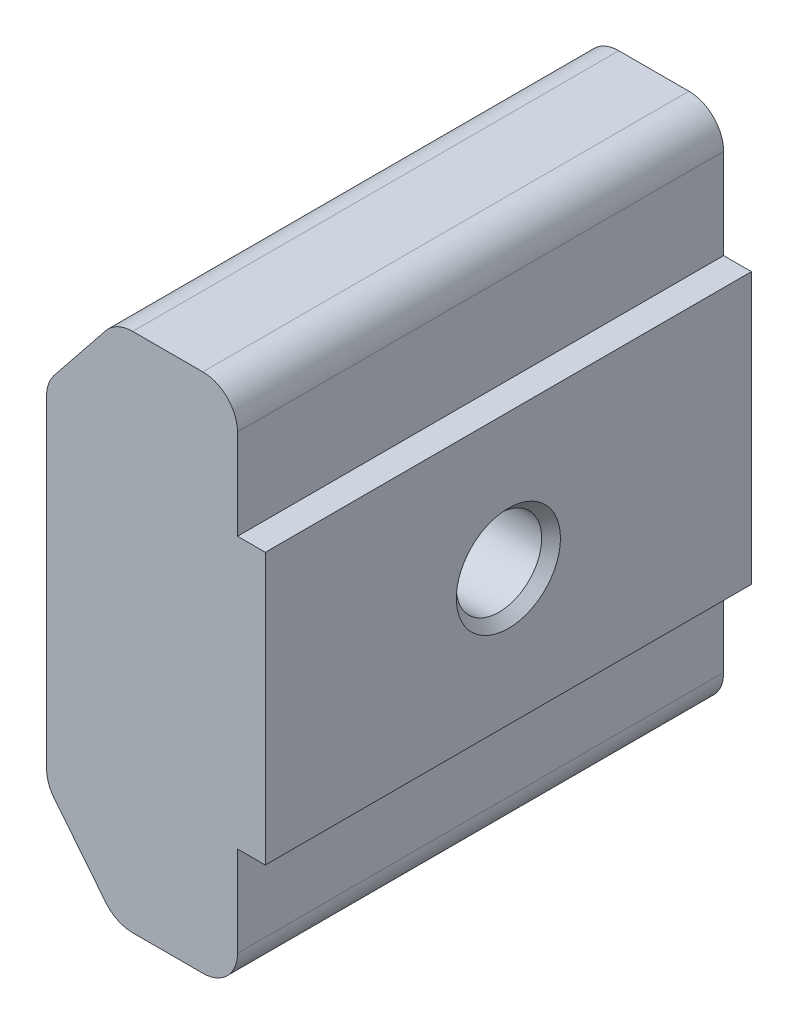
ISO-10303-21;
HEADER;
FILE_DESCRIPTION(('STEP AP214'),'2;1');
FILE_NAME('part.step','',(''),(''),'','','');
FILE_SCHEMA(('AUTOMOTIVE_DESIGN { 1 0 10303 214 1 1 1 1 }'));
ENDSEC;
DATA;
#1=APPLICATION_CONTEXT('core data for automotive mechanical design processes');
#2=APPLICATION_PROTOCOL_DEFINITION('international standard','automotive_design',2000,#1);
#3=PRODUCT_CONTEXT('',#1,'mechanical');
#4=PRODUCT('Part','Part','',(#3));
#5=PRODUCT_RELATED_PRODUCT_CATEGORY('part','',(#4));
#6=PRODUCT_DEFINITION_FORMATION('','',#4);
#7=PRODUCT_DEFINITION_CONTEXT('part definition',#1,'design');
#8=PRODUCT_DEFINITION('design','',#6,#7);
#9=PRODUCT_DEFINITION_SHAPE('','',#8);
#10=(LENGTH_UNIT() NAMED_UNIT(*) SI_UNIT(.MILLI.,.METRE.));
#11=(NAMED_UNIT(*) PLANE_ANGLE_UNIT() SI_UNIT($,.RADIAN.));
#12=(NAMED_UNIT(*) SI_UNIT($,.STERADIAN.) SOLID_ANGLE_UNIT());
#13=UNCERTAINTY_MEASURE_WITH_UNIT(LENGTH_MEASURE(1.E-05),#10,'distance_accuracy_value','');
#14=(GEOMETRIC_REPRESENTATION_CONTEXT(3) GLOBAL_UNCERTAINTY_ASSIGNED_CONTEXT((#13)) GLOBAL_UNIT_ASSIGNED_CONTEXT((#10,
#11,#12)) REPRESENTATION_CONTEXT('',''));
#15=CARTESIAN_POINT('',(0.,0.,0.));
#16=DIRECTION('',(0.,0.,1.));
#17=DIRECTION('',(1.,0.,0.));
#18=AXIS2_PLACEMENT_3D('',#15,#16,#17);
#19=CARTESIAN_POINT('',(-6.3,4.64921894064179,7.));
#20=DIRECTION('',(1.,0.,0.));
#21=DIRECTION('',(0.,0.,-1.));
#22=AXIS2_PLACEMENT_3D('',#19,#20,#21);
#23=PLANE('',#22);
#24=CARTESIAN_POINT('',(-6.3,0.,0.));
#25=DIRECTION('',(1.,0.,0.));
#26=DIRECTION('',(0.,0.,-1.));
#27=AXIS2_PLACEMENT_3D('',#24,#25,#26);
#28=CIRCLE('',#27,1.5);
#29=CARTESIAN_POINT('',(-6.3,0.,-1.5));
#30=VERTEX_POINT('',#29);
#31=EDGE_CURVE('E164',#30,#30,#28,.T.);
#32=ORIENTED_EDGE('',*,*,#31,.T.);
#33=EDGE_LOOP('',(#32));
#34=FACE_BOUND('',#33,.T.);
#35=DIRECTION('',(0.,-1.,0.));
#36=VECTOR('',#35,1.);
#37=CARTESIAN_POINT('',(-6.3,4.64921894064179,-7.));
#38=LINE('',#37,#36);
#39=CARTESIAN_POINT('',(-6.3,4.64921894064179,-7.));
#40=VERTEX_POINT('',#39);
#41=CARTESIAN_POINT('',(-6.3,-4.64921894064179,-7.));
#42=VERTEX_POINT('',#41);
#43=EDGE_CURVE('E160',#40,#42,#38,.T.);
#44=ORIENTED_EDGE('',*,*,#43,.T.);
#45=DIRECTION('',(0.,0.,-1.));
#46=VECTOR('',#45,1.);
#47=CARTESIAN_POINT('',(-6.3,-4.64921894064179,7.));
#48=LINE('',#47,#46);
#49=CARTESIAN_POINT('',(-6.3,-4.64921894064179,7.));
#50=VERTEX_POINT('',#49);
#51=EDGE_CURVE('E11',#50,#42,#48,.T.);
#52=ORIENTED_EDGE('',*,*,#51,.F.);
#53=DIRECTION('',(0.,-1.,0.));
#54=VECTOR('',#53,1.);
#55=CARTESIAN_POINT('',(-6.3,4.64921894064179,7.));
#56=LINE('',#55,#54);
#57=CARTESIAN_POINT('',(-6.3,4.64921894064179,7.));
#58=VERTEX_POINT('',#57);
#59=EDGE_CURVE('E191',#58,#50,#56,.T.);
#60=ORIENTED_EDGE('',*,*,#59,.F.);
#61=DIRECTION('',(0.,0.,-1.));
#62=VECTOR('',#61,1.);
#63=CARTESIAN_POINT('',(-6.3,4.64921894064179,7.));
#64=LINE('',#63,#62);
#65=EDGE_CURVE('E156',#58,#40,#64,.T.);
#66=ORIENTED_EDGE('',*,*,#65,.T.);
#67=EDGE_LOOP('',(#44,#52,#60,#66));
#68=FACE_BOUND('',#67,.T.);
#69=ADVANCED_FACE('F16',(#34,#68),#23,.F.);
#70=CARTESIAN_POINT('',(-5.3,-4.64921894064179,7.));
#71=DIRECTION('',(0.,0.,-1.));
#72=DIRECTION('',(-1.,0.,0.));
#73=AXIS2_PLACEMENT_3D('',#70,#71,#72);
#74=CYLINDRICAL_SURFACE('',#73,0.999999999999996);
#75=CARTESIAN_POINT('',(-5.3,-4.64921894064179,-7.));
#76=DIRECTION('',(0.,0.,1.));
#77=DIRECTION('',(1.,0.,0.));
#78=AXIS2_PLACEMENT_3D('',#75,#76,#77);
#79=CIRCLE('',#78,0.999999999999996);
#80=CARTESIAN_POINT('',(-6.08086880944303,-5.27391398819621,-7.));
#81=VERTEX_POINT('',#80);
#82=EDGE_CURVE('E163',#42,#81,#79,.T.);
#83=ORIENTED_EDGE('',*,*,#82,.T.);
#84=DIRECTION('',(0.,0.,-1.));
#85=VECTOR('',#84,1.);
#86=CARTESIAN_POINT('',(-6.08086880944303,-5.27391398819621,7.));
#87=LINE('',#86,#85);
#88=CARTESIAN_POINT('',(-6.08086880944303,-5.27391398819621,7.));
#89=VERTEX_POINT('',#88);
#90=EDGE_CURVE('E24',#89,#81,#87,.T.);
#91=ORIENTED_EDGE('',*,*,#90,.F.);
#92=CARTESIAN_POINT('',(-5.3,-4.64921894064179,7.));
#93=DIRECTION('',(0.,0.,1.));
#94=DIRECTION('',(1.,0.,0.));
#95=AXIS2_PLACEMENT_3D('',#92,#93,#94);
#96=CIRCLE('',#95,0.999999999999996);
#97=EDGE_CURVE('E99',#50,#89,#96,.T.);
#98=ORIENTED_EDGE('',*,*,#97,.F.);
#99=ORIENTED_EDGE('',*,*,#51,.T.);
#100=EDGE_LOOP('',(#83,#91,#98,#99));
#101=FACE_BOUND('',#100,.T.);
#102=ADVANCED_FACE('F290',(#101),#74,.T.);
#103=CARTESIAN_POINT('',(-6.08086880944303,-5.27391398819621,7.));
#104=DIRECTION('',(0.78086880944303,0.624695047554424,0.));
#105=DIRECTION('',(-0.624695047554424,0.78086880944303,0.));
#106=AXIS2_PLACEMENT_3D('',#103,#104,#105);
#107=PLANE('',#106);
#108=DIRECTION('',(0.624695047554424,-0.78086880944303,0.));
#109=VECTOR('',#108,1.);
#110=CARTESIAN_POINT('',(-6.08086880944303,-5.27391398819621,-7.));
#111=LINE('',#110,#109);
#112=CARTESIAN_POINT('',(-4.60024396195646,-7.12469504755442,-7.));
#113=VERTEX_POINT('',#112);
#114=EDGE_CURVE('E166',#81,#113,#111,.T.);
#115=ORIENTED_EDGE('',*,*,#114,.T.);
#116=DIRECTION('',(0.,0.,-1.));
#117=VECTOR('',#116,1.);
#118=CARTESIAN_POINT('',(-4.60024396195646,-7.12469504755442,7.));
#119=LINE('',#118,#117);
#120=CARTESIAN_POINT('',(-4.60024396195646,-7.12469504755442,7.));
#121=VERTEX_POINT('',#120);
#122=EDGE_CURVE('E222',#121,#113,#119,.T.);
#123=ORIENTED_EDGE('',*,*,#122,.F.);
#124=DIRECTION('',(0.624695047554424,-0.78086880944303,0.));
#125=VECTOR('',#124,1.);
#126=CARTESIAN_POINT('',(-6.08086880944303,-5.27391398819621,7.));
#127=LINE('',#126,#125);
#128=EDGE_CURVE('E230',#89,#121,#127,.T.);
#129=ORIENTED_EDGE('',*,*,#128,.F.);
#130=ORIENTED_EDGE('',*,*,#90,.T.);
#131=EDGE_LOOP('',(#115,#123,#129,#130));
#132=FACE_BOUND('',#131,.T.);
#133=ADVANCED_FACE('F228',(#132),#107,.F.);
#134=CARTESIAN_POINT('',(-3.81937515251344,-6.50000000000001,7.));
#135=DIRECTION('',(0.,0.,-1.));
#136=DIRECTION('',(-1.,0.,0.));
#137=AXIS2_PLACEMENT_3D('',#134,#135,#136);
#138=CYLINDRICAL_SURFACE('',#137,0.999999999999987);
#139=CARTESIAN_POINT('',(-3.81937515251344,-6.50000000000001,-7.));
#140=DIRECTION('',(0.,0.,1.));
#141=DIRECTION('',(1.,0.,0.));
#142=AXIS2_PLACEMENT_3D('',#139,#140,#141);
#143=CIRCLE('',#142,0.999999999999987);
#144=CARTESIAN_POINT('',(-3.81937515251343,-7.5,-7.));
#145=VERTEX_POINT('',#144);
#146=EDGE_CURVE('E168',#113,#145,#143,.T.);
#147=ORIENTED_EDGE('',*,*,#146,.T.);
#148=DIRECTION('',(0.,0.,-1.));
#149=VECTOR('',#148,1.);
#150=CARTESIAN_POINT('',(-3.81937515251343,-7.5,7.));
#151=LINE('',#150,#149);
#152=CARTESIAN_POINT('',(-3.81937515251343,-7.5,7.));
#153=VERTEX_POINT('',#152);
#154=EDGE_CURVE('E219',#153,#145,#151,.T.);
#155=ORIENTED_EDGE('',*,*,#154,.F.);
#156=CARTESIAN_POINT('',(-3.81937515251344,-6.50000000000001,7.));
#157=DIRECTION('',(0.,0.,1.));
#158=DIRECTION('',(1.,0.,0.));
#159=AXIS2_PLACEMENT_3D('',#156,#157,#158);
#160=CIRCLE('',#159,0.999999999999987);
#161=EDGE_CURVE('E248',#121,#153,#160,.T.);
#162=ORIENTED_EDGE('',*,*,#161,.F.);
#163=ORIENTED_EDGE('',*,*,#122,.T.);
#164=EDGE_LOOP('',(#147,#155,#162,#163));
#165=FACE_BOUND('',#164,.T.);
#166=ADVANCED_FACE('F239',(#165),#138,.T.);
#167=CARTESIAN_POINT('',(-3.81937515251343,-7.5,7.));
#168=DIRECTION('',(0.,1.,0.));
#169=DIRECTION('',(0.,0.,1.));
#170=AXIS2_PLACEMENT_3D('',#167,#168,#169);
#171=PLANE('',#170);
#172=DIRECTION('',(1.,0.,0.));
#173=VECTOR('',#172,1.);
#174=CARTESIAN_POINT('',(-3.81937515251343,-7.5,-7.));
#175=LINE('',#174,#173);
#176=CARTESIAN_POINT('',(-1.8,-7.5,-7.));
#177=VERTEX_POINT('',#176);
#178=EDGE_CURVE('E170',#145,#177,#175,.T.);
#179=ORIENTED_EDGE('',*,*,#178,.T.);
#180=DIRECTION('',(0.,0.,-1.));
#181=VECTOR('',#180,1.);
#182=CARTESIAN_POINT('',(-1.8,-7.5,7.));
#183=LINE('',#182,#181);
#184=CARTESIAN_POINT('',(-1.8,-7.5,7.));
#185=VERTEX_POINT('',#184);
#186=EDGE_CURVE('E216',#185,#177,#183,.T.);
#187=ORIENTED_EDGE('',*,*,#186,.F.);
#188=DIRECTION('',(1.,0.,0.));
#189=VECTOR('',#188,1.);
#190=CARTESIAN_POINT('',(-3.81937515251343,-7.5,7.));
#191=LINE('',#190,#189);
#192=EDGE_CURVE('E245',#153,#185,#191,.T.);
#193=ORIENTED_EDGE('',*,*,#192,.F.);
#194=ORIENTED_EDGE('',*,*,#154,.T.);
#195=EDGE_LOOP('',(#179,#187,#193,#194));
#196=FACE_BOUND('',#195,.T.);
#197=ADVANCED_FACE('F243',(#196),#171,.F.);
#198=CARTESIAN_POINT('',(-1.8,-6.5,7.));
#199=DIRECTION('',(0.,0.,-1.));
#200=DIRECTION('',(-1.,0.,0.));
#201=AXIS2_PLACEMENT_3D('',#198,#199,#200);
#202=CYLINDRICAL_SURFACE('',#201,0.999999999999997);
#203=CARTESIAN_POINT('',(-1.8,-6.5,-7.));
#204=DIRECTION('',(0.,0.,1.));
#205=DIRECTION('',(1.,0.,0.));
#206=AXIS2_PLACEMENT_3D('',#203,#204,#205);
#207=CIRCLE('',#206,0.999999999999997);
#208=CARTESIAN_POINT('',(-0.8,-6.5,-7.));
#209=VERTEX_POINT('',#208);
#210=EDGE_CURVE('E172',#177,#209,#207,.T.);
#211=ORIENTED_EDGE('',*,*,#210,.T.);
#212=DIRECTION('',(0.,0.,-1.));
#213=VECTOR('',#212,1.);
#214=CARTESIAN_POINT('',(-0.8,-6.5,7.));
#215=LINE('',#214,#213);
#216=CARTESIAN_POINT('',(-0.8,-6.5,7.));
#217=VERTEX_POINT('',#216);
#218=EDGE_CURVE('E213',#217,#209,#215,.T.);
#219=ORIENTED_EDGE('',*,*,#218,.F.);
#220=CARTESIAN_POINT('',(-1.8,-6.5,7.));
#221=DIRECTION('',(0.,0.,1.));
#222=DIRECTION('',(1.,0.,0.));
#223=AXIS2_PLACEMENT_3D('',#220,#221,#222);
#224=CIRCLE('',#223,0.999999999999997);
#225=EDGE_CURVE('E247',#185,#217,#224,.T.);
#226=ORIENTED_EDGE('',*,*,#225,.F.);
#227=ORIENTED_EDGE('',*,*,#186,.T.);
#228=EDGE_LOOP('',(#211,#219,#226,#227));
#229=FACE_BOUND('',#228,.T.);
#230=ADVANCED_FACE('F349',(#229),#202,.T.);
#231=CARTESIAN_POINT('',(-0.8,-6.5,7.));
#232=DIRECTION('',(-1.,0.,0.));
#233=DIRECTION('',(0.,0.,1.));
#234=AXIS2_PLACEMENT_3D('',#231,#232,#233);
#235=PLANE('',#234);
#236=DIRECTION('',(0.,1.,0.));
#237=VECTOR('',#236,1.);
#238=CARTESIAN_POINT('',(-0.8,-6.5,-7.));
#239=LINE('',#238,#237);
#240=CARTESIAN_POINT('',(-0.8,-3.9,-7.));
#241=VERTEX_POINT('',#240);
#242=EDGE_CURVE('E174',#209,#241,#239,.T.);
#243=ORIENTED_EDGE('',*,*,#242,.T.);
#244=DIRECTION('',(0.,0.,-1.));
#245=VECTOR('',#244,1.);
#246=CARTESIAN_POINT('',(-0.8,-3.9,7.));
#247=LINE('',#246,#245);
#248=CARTESIAN_POINT('',(-0.8,-3.9,7.));
#249=VERTEX_POINT('',#248);
#250=EDGE_CURVE('E210',#249,#241,#247,.T.);
#251=ORIENTED_EDGE('',*,*,#250,.F.);
#252=DIRECTION('',(0.,1.,0.));
#253=VECTOR('',#252,1.);
#254=CARTESIAN_POINT('',(-0.8,-6.5,7.));
#255=LINE('',#254,#253);
#256=EDGE_CURVE('E250',#217,#249,#255,.T.);
#257=ORIENTED_EDGE('',*,*,#256,.F.);
#258=ORIENTED_EDGE('',*,*,#218,.T.);
#259=EDGE_LOOP('',(#243,#251,#257,#258));
#260=FACE_BOUND('',#259,.T.);
#261=ADVANCED_FACE('F345',(#260),#235,.F.);
#262=CARTESIAN_POINT('',(-0.8,-3.9,7.));
#263=DIRECTION('',(0.,1.,0.));
#264=DIRECTION('',(-1.,0.,0.));
#265=AXIS2_PLACEMENT_3D('',#262,#263,#264);
#266=PLANE('',#265);
#267=DIRECTION('',(1.,0.,0.));
#268=VECTOR('',#267,1.);
#269=CARTESIAN_POINT('',(-0.8,-3.9,-7.));
#270=LINE('',#269,#268);
#271=CARTESIAN_POINT('',(0.,-3.9,-7.));
#272=VERTEX_POINT('',#271);
#273=EDGE_CURVE('E176',#241,#272,#270,.T.);
#274=ORIENTED_EDGE('',*,*,#273,.T.);
#275=DIRECTION('',(0.,0.,-1.));
#276=VECTOR('',#275,1.);
#277=CARTESIAN_POINT('',(0.,-3.9,7.));
#278=LINE('',#277,#276);
#279=CARTESIAN_POINT('',(0.,-3.9,7.));
#280=VERTEX_POINT('',#279);
#281=EDGE_CURVE('E207',#280,#272,#278,.T.);
#282=ORIENTED_EDGE('',*,*,#281,.F.);
#283=DIRECTION('',(1.,0.,0.));
#284=VECTOR('',#283,1.);
#285=CARTESIAN_POINT('',(-0.8,-3.9,7.));
#286=LINE('',#285,#284);
#287=EDGE_CURVE('E256',#249,#280,#286,.T.);
#288=ORIENTED_EDGE('',*,*,#287,.F.);
#289=ORIENTED_EDGE('',*,*,#250,.T.);
#290=EDGE_LOOP('',(#274,#282,#288,#289));
#291=FACE_BOUND('',#290,.T.);
#292=ADVANCED_FACE('F319',(#291),#266,.F.);
#293=CARTESIAN_POINT('',(0.,-3.9,7.));
#294=DIRECTION('',(-1.,0.,0.));
#295=DIRECTION('',(0.,0.,1.));
#296=AXIS2_PLACEMENT_3D('',#293,#294,#295);
#297=PLANE('',#296);
#298=CARTESIAN_POINT('',(0.,0.,0.));
#299=DIRECTION('',(1.,0.,0.));
#300=DIRECTION('',(0.,0.,-1.));
#301=AXIS2_PLACEMENT_3D('',#298,#299,#300);
#302=CIRCLE('',#301,1.5);
#303=CARTESIAN_POINT('',(0.,0.,-1.5));
#304=VERTEX_POINT('',#303);
#305=EDGE_CURVE('E308',#304,#304,#302,.T.);
#306=ORIENTED_EDGE('',*,*,#305,.F.);
#307=EDGE_LOOP('',(#306));
#308=FACE_BOUND('',#307,.T.);
#309=DIRECTION('',(0.,1.,0.));
#310=VECTOR('',#309,1.);
#311=CARTESIAN_POINT('',(0.,-3.9,-7.));
#312=LINE('',#311,#310);
#313=CARTESIAN_POINT('',(0.,3.9,-7.));
#314=VERTEX_POINT('',#313);
#315=EDGE_CURVE('E178',#272,#314,#312,.T.);
#316=ORIENTED_EDGE('',*,*,#315,.T.);
#317=DIRECTION('',(0.,0.,-1.));
#318=VECTOR('',#317,1.);
#319=CARTESIAN_POINT('',(0.,3.9,7.));
#320=LINE('',#319,#318);
#321=CARTESIAN_POINT('',(0.,3.9,7.));
#322=VERTEX_POINT('',#321);
#323=EDGE_CURVE('E204',#322,#314,#320,.T.);
#324=ORIENTED_EDGE('',*,*,#323,.F.);
#325=DIRECTION('',(0.,1.,0.));
#326=VECTOR('',#325,1.);
#327=CARTESIAN_POINT('',(0.,-3.9,7.));
#328=LINE('',#327,#326);
#329=EDGE_CURVE('E258',#280,#322,#328,.T.);
#330=ORIENTED_EDGE('',*,*,#329,.F.);
#331=ORIENTED_EDGE('',*,*,#281,.T.);
#332=EDGE_LOOP('',(#316,#324,#330,#331));
#333=FACE_BOUND('',#332,.T.);
#334=ADVANCED_FACE('F315',(#308,#333),#297,.F.);
#335=CARTESIAN_POINT('',(0.,3.9,7.));
#336=DIRECTION('',(0.,-1.,0.));
#337=DIRECTION('',(1.,0.,0.));
#338=AXIS2_PLACEMENT_3D('',#335,#336,#337);
#339=PLANE('',#338);
#340=DIRECTION('',(-1.,0.,0.));
#341=VECTOR('',#340,1.);
#342=CARTESIAN_POINT('',(0.,3.9,-7.));
#343=LINE('',#342,#341);
#344=CARTESIAN_POINT('',(-0.8,3.9,-7.));
#345=VERTEX_POINT('',#344);
#346=EDGE_CURVE('E180',#314,#345,#343,.T.);
#347=ORIENTED_EDGE('',*,*,#346,.T.);
#348=DIRECTION('',(0.,0.,-1.));
#349=VECTOR('',#348,1.);
#350=CARTESIAN_POINT('',(-0.8,3.9,7.));
#351=LINE('',#350,#349);
#352=CARTESIAN_POINT('',(-0.8,3.9,7.));
#353=VERTEX_POINT('',#352);
#354=EDGE_CURVE('E201',#353,#345,#351,.T.);
#355=ORIENTED_EDGE('',*,*,#354,.F.);
#356=DIRECTION('',(-1.,0.,0.));
#357=VECTOR('',#356,1.);
#358=CARTESIAN_POINT('',(0.,3.9,7.));
#359=LINE('',#358,#357);
#360=EDGE_CURVE('E260',#322,#353,#359,.T.);
#361=ORIENTED_EDGE('',*,*,#360,.F.);
#362=ORIENTED_EDGE('',*,*,#323,.T.);
#363=EDGE_LOOP('',(#347,#355,#361,#362));
#364=FACE_BOUND('',#363,.T.);
#365=ADVANCED_FACE('F318',(#364),#339,.F.);
#366=CARTESIAN_POINT('',(-0.8,3.9,7.));
#367=DIRECTION('',(-1.,0.,0.));
#368=DIRECTION('',(0.,0.,1.));
#369=AXIS2_PLACEMENT_3D('',#366,#367,#368);
#370=PLANE('',#369);
#371=DIRECTION('',(0.,1.,0.));
#372=VECTOR('',#371,1.);
#373=CARTESIAN_POINT('',(-0.8,3.9,-7.));
#374=LINE('',#373,#372);
#375=CARTESIAN_POINT('',(-0.8,6.5,-7.));
#376=VERTEX_POINT('',#375);
#377=EDGE_CURVE('E182',#345,#376,#374,.T.);
#378=ORIENTED_EDGE('',*,*,#377,.T.);
#379=DIRECTION('',(0.,0.,-1.));
#380=VECTOR('',#379,1.);
#381=CARTESIAN_POINT('',(-0.8,6.5,7.));
#382=LINE('',#381,#380);
#383=CARTESIAN_POINT('',(-0.8,6.5,7.));
#384=VERTEX_POINT('',#383);
#385=EDGE_CURVE('E198',#384,#376,#382,.T.);
#386=ORIENTED_EDGE('',*,*,#385,.F.);
#387=DIRECTION('',(0.,1.,0.));
#388=VECTOR('',#387,1.);
#389=CARTESIAN_POINT('',(-0.8,3.9,7.));
#390=LINE('',#389,#388);
#391=EDGE_CURVE('E262',#353,#384,#390,.T.);
#392=ORIENTED_EDGE('',*,*,#391,.F.);
#393=ORIENTED_EDGE('',*,*,#354,.T.);
#394=EDGE_LOOP('',(#378,#386,#392,#393));
#395=FACE_BOUND('',#394,.T.);
#396=ADVANCED_FACE('F332',(#395),#370,.F.);
#397=CARTESIAN_POINT('',(-1.8,6.5,7.));
#398=DIRECTION('',(0.,0.,-1.));
#399=DIRECTION('',(-1.,0.,0.));
#400=AXIS2_PLACEMENT_3D('',#397,#398,#399);
#401=CYLINDRICAL_SURFACE('',#400,1.);
#402=CARTESIAN_POINT('',(-1.8,6.5,-7.));
#403=DIRECTION('',(0.,0.,1.));
#404=DIRECTION('',(1.,0.,0.));
#405=AXIS2_PLACEMENT_3D('',#402,#403,#404);
#406=CIRCLE('',#405,1.);
#407=CARTESIAN_POINT('',(-1.8,7.5,-7.));
#408=VERTEX_POINT('',#407);
#409=EDGE_CURVE('E184',#376,#408,#406,.T.);
#410=ORIENTED_EDGE('',*,*,#409,.T.);
#411=DIRECTION('',(0.,0.,-1.));
#412=VECTOR('',#411,1.);
#413=CARTESIAN_POINT('',(-1.8,7.5,7.));
#414=LINE('',#413,#412);
#415=CARTESIAN_POINT('',(-1.8,7.5,7.));
#416=VERTEX_POINT('',#415);
#417=EDGE_CURVE('E195',#416,#408,#414,.T.);
#418=ORIENTED_EDGE('',*,*,#417,.F.);
#419=CARTESIAN_POINT('',(-1.8,6.5,7.));
#420=DIRECTION('',(0.,0.,1.));
#421=DIRECTION('',(1.,0.,0.));
#422=AXIS2_PLACEMENT_3D('',#419,#420,#421);
#423=CIRCLE('',#422,1.);
#424=EDGE_CURVE('E264',#384,#416,#423,.T.);
#425=ORIENTED_EDGE('',*,*,#424,.F.);
#426=ORIENTED_EDGE('',*,*,#385,.T.);
#427=EDGE_LOOP('',(#410,#418,#425,#426));
#428=FACE_BOUND('',#427,.T.);
#429=ADVANCED_FACE('F270',(#428),#401,.T.);
#430=CARTESIAN_POINT('',(-1.8,7.5,7.));
#431=DIRECTION('',(0.,-1.,0.));
#432=DIRECTION('',(0.,0.,-1.));
#433=AXIS2_PLACEMENT_3D('',#430,#431,#432);
#434=PLANE('',#433);
#435=DIRECTION('',(-1.,0.,0.));
#436=VECTOR('',#435,1.);
#437=CARTESIAN_POINT('',(-1.8,7.5,-7.));
#438=LINE('',#437,#436);
#439=CARTESIAN_POINT('',(-3.81937515251343,7.5,-7.));
#440=VERTEX_POINT('',#439);
#441=EDGE_CURVE('E186',#408,#440,#438,.T.);
#442=ORIENTED_EDGE('',*,*,#441,.T.);
#443=DIRECTION('',(0.,0.,-1.));
#444=VECTOR('',#443,1.);
#445=CARTESIAN_POINT('',(-3.81937515251343,7.5,7.));
#446=LINE('',#445,#444);
#447=CARTESIAN_POINT('',(-3.81937515251343,7.5,7.));
#448=VERTEX_POINT('',#447);
#449=EDGE_CURVE('E151',#448,#440,#446,.T.);
#450=ORIENTED_EDGE('',*,*,#449,.F.);
#451=DIRECTION('',(-1.,0.,0.));
#452=VECTOR('',#451,1.);
#453=CARTESIAN_POINT('',(-1.8,7.5,7.));
#454=LINE('',#453,#452);
#455=EDGE_CURVE('E142',#416,#448,#454,.T.);
#456=ORIENTED_EDGE('',*,*,#455,.F.);
#457=ORIENTED_EDGE('',*,*,#417,.T.);
#458=EDGE_LOOP('',(#442,#450,#456,#457));
#459=FACE_BOUND('',#458,.T.);
#460=ADVANCED_FACE('F274',(#459),#434,.F.);
#461=CARTESIAN_POINT('',(-3.81937515251344,6.50000000000001,7.));
#462=DIRECTION('',(0.,0.,-1.));
#463=DIRECTION('',(-1.,0.,0.));
#464=AXIS2_PLACEMENT_3D('',#461,#462,#463);
#465=CYLINDRICAL_SURFACE('',#464,0.999999999999985);
#466=CARTESIAN_POINT('',(-3.81937515251344,6.50000000000001,-7.));
#467=DIRECTION('',(0.,0.,1.));
#468=DIRECTION('',(1.,0.,0.));
#469=AXIS2_PLACEMENT_3D('',#466,#467,#468);
#470=CIRCLE('',#469,0.999999999999985);
#471=CARTESIAN_POINT('',(-4.60024396195646,7.12469504755442,-7.));
#472=VERTEX_POINT('',#471);
#473=EDGE_CURVE('E150',#440,#472,#470,.T.);
#474=ORIENTED_EDGE('',*,*,#473,.T.);
#475=DIRECTION('',(0.,0.,-1.));
#476=VECTOR('',#475,1.);
#477=CARTESIAN_POINT('',(-4.60024396195646,7.12469504755442,7.));
#478=LINE('',#477,#476);
#479=CARTESIAN_POINT('',(-4.60024396195646,7.12469504755442,7.));
#480=VERTEX_POINT('',#479);
#481=EDGE_CURVE('E147',#480,#472,#478,.T.);
#482=ORIENTED_EDGE('',*,*,#481,.F.);
#483=CARTESIAN_POINT('',(-3.81937515251344,6.50000000000001,7.));
#484=DIRECTION('',(0.,0.,1.));
#485=DIRECTION('',(1.,0.,0.));
#486=AXIS2_PLACEMENT_3D('',#483,#484,#485);
#487=CIRCLE('',#486,0.999999999999985);
#488=EDGE_CURVE('E136',#448,#480,#487,.T.);
#489=ORIENTED_EDGE('',*,*,#488,.F.);
#490=ORIENTED_EDGE('',*,*,#449,.T.);
#491=EDGE_LOOP('',(#474,#482,#489,#490));
#492=FACE_BOUND('',#491,.T.);
#493=ADVANCED_FACE('F148',(#492),#465,.T.);
#494=CARTESIAN_POINT('',(-4.60024396195646,7.12469504755442,7.));
#495=DIRECTION('',(0.78086880944303,-0.624695047554424,0.));
#496=DIRECTION('',(0.624695047554424,0.78086880944303,0.));
#497=AXIS2_PLACEMENT_3D('',#494,#495,#496);
#498=PLANE('',#497);
#499=DIRECTION('',(-0.624695047554424,-0.78086880944303,0.));
#500=VECTOR('',#499,1.);
#501=CARTESIAN_POINT('',(-4.60024396195646,7.12469504755442,-7.));
#502=LINE('',#501,#500);
#503=CARTESIAN_POINT('',(-6.08086880944303,5.27391398819621,-7.));
#504=VERTEX_POINT('',#503);
#505=EDGE_CURVE('E85',#472,#504,#502,.T.);
#506=ORIENTED_EDGE('',*,*,#505,.T.);
#507=DIRECTION('',(0.,0.,-1.));
#508=VECTOR('',#507,1.);
#509=CARTESIAN_POINT('',(-6.08086880944303,5.27391398819621,7.));
#510=LINE('',#509,#508);
#511=CARTESIAN_POINT('',(-6.08086880944303,5.27391398819621,7.));
#512=VERTEX_POINT('',#511);
#513=EDGE_CURVE('E152',#512,#504,#510,.T.);
#514=ORIENTED_EDGE('',*,*,#513,.F.);
#515=DIRECTION('',(-0.624695047554424,-0.78086880944303,0.));
#516=VECTOR('',#515,1.);
#517=CARTESIAN_POINT('',(-4.60024396195646,7.12469504755442,7.));
#518=LINE('',#517,#516);
#519=EDGE_CURVE('E140',#480,#512,#518,.T.);
#520=ORIENTED_EDGE('',*,*,#519,.F.);
#521=ORIENTED_EDGE('',*,*,#481,.T.);
#522=EDGE_LOOP('',(#506,#514,#520,#521));
#523=FACE_BOUND('',#522,.T.);
#524=ADVANCED_FACE('F154',(#523),#498,.F.);
#525=CARTESIAN_POINT('',(-5.30000000000002,4.64921894064179,7.));
#526=DIRECTION('',(0.,0.,-1.));
#527=DIRECTION('',(-1.,0.,0.));
#528=AXIS2_PLACEMENT_3D('',#525,#526,#527);
#529=CYLINDRICAL_SURFACE('',#528,0.999999999999984);
#530=CARTESIAN_POINT('',(-5.30000000000002,4.64921894064179,-7.));
#531=DIRECTION('',(0.,0.,1.));
#532=DIRECTION('',(1.,0.,0.));
#533=AXIS2_PLACEMENT_3D('',#530,#531,#532);
#534=CIRCLE('',#533,0.999999999999984);
#535=EDGE_CURVE('E91',#504,#40,#534,.T.);
#536=ORIENTED_EDGE('',*,*,#535,.T.);
#537=ORIENTED_EDGE('',*,*,#65,.F.);
#538=CARTESIAN_POINT('',(-5.30000000000002,4.64921894064179,7.));
#539=DIRECTION('',(0.,0.,1.));
#540=DIRECTION('',(1.,0.,0.));
#541=AXIS2_PLACEMENT_3D('',#538,#539,#540);
#542=CIRCLE('',#541,0.999999999999984);
#543=EDGE_CURVE('E32',#512,#58,#542,.T.);
#544=ORIENTED_EDGE('',*,*,#543,.F.);
#545=ORIENTED_EDGE('',*,*,#513,.T.);
#546=EDGE_LOOP('',(#536,#537,#544,#545));
#547=FACE_BOUND('',#546,.T.);
#548=ADVANCED_FACE('F278',(#547),#529,.T.);
#549=CARTESIAN_POINT('',(-5.3,-4.64921894064179,7.));
#550=DIRECTION('',(0.,0.,1.));
#551=DIRECTION('',(1.,0.,0.));
#552=AXIS2_PLACEMENT_3D('',#549,#550,#551);
#553=PLANE('',#552);
#554=ORIENTED_EDGE('',*,*,#59,.T.);
#555=ORIENTED_EDGE('',*,*,#97,.T.);
#556=ORIENTED_EDGE('',*,*,#128,.T.);
#557=ORIENTED_EDGE('',*,*,#161,.T.);
#558=ORIENTED_EDGE('',*,*,#192,.T.);
#559=ORIENTED_EDGE('',*,*,#225,.T.);
#560=ORIENTED_EDGE('',*,*,#256,.T.);
#561=ORIENTED_EDGE('',*,*,#287,.T.);
#562=ORIENTED_EDGE('',*,*,#329,.T.);
#563=ORIENTED_EDGE('',*,*,#360,.T.);
#564=ORIENTED_EDGE('',*,*,#391,.T.);
#565=ORIENTED_EDGE('',*,*,#424,.T.);
#566=ORIENTED_EDGE('',*,*,#455,.T.);
#567=ORIENTED_EDGE('',*,*,#488,.T.);
#568=ORIENTED_EDGE('',*,*,#519,.T.);
#569=ORIENTED_EDGE('',*,*,#543,.T.);
#570=EDGE_LOOP('',(#554,#555,#556,#557,#558,#559,#560,#561,#562,#563,#564,#565,#566,#567,#568,#569));
#571=FACE_BOUND('',#570,.T.);
#572=ADVANCED_FACE('F138',(#571),#553,.T.);
#573=CARTESIAN_POINT('',(-5.3,-4.64921894064179,-7.));
#574=DIRECTION('',(0.,0.,1.));
#575=DIRECTION('',(1.,0.,0.));
#576=AXIS2_PLACEMENT_3D('',#573,#574,#575);
#577=PLANE('',#576);
#578=ORIENTED_EDGE('',*,*,#43,.F.);
#579=ORIENTED_EDGE('',*,*,#535,.F.);
#580=ORIENTED_EDGE('',*,*,#505,.F.);
#581=ORIENTED_EDGE('',*,*,#473,.F.);
#582=ORIENTED_EDGE('',*,*,#441,.F.);
#583=ORIENTED_EDGE('',*,*,#409,.F.);
#584=ORIENTED_EDGE('',*,*,#377,.F.);
#585=ORIENTED_EDGE('',*,*,#346,.F.);
#586=ORIENTED_EDGE('',*,*,#315,.F.);
#587=ORIENTED_EDGE('',*,*,#273,.F.);
#588=ORIENTED_EDGE('',*,*,#242,.F.);
#589=ORIENTED_EDGE('',*,*,#210,.F.);
#590=ORIENTED_EDGE('',*,*,#178,.F.);
#591=ORIENTED_EDGE('',*,*,#146,.F.);
#592=ORIENTED_EDGE('',*,*,#114,.F.);
#593=ORIENTED_EDGE('',*,*,#82,.F.);
#594=EDGE_LOOP('',(#578,#579,#580,#581,#582,#583,#584,#585,#586,#587,#588,#589,#590,#591,#592,#593));
#595=FACE_BOUND('',#594,.T.);
#596=ADVANCED_FACE('F234',(#595),#577,.F.);
#597=CARTESIAN_POINT('',(-6.3,0.,0.));
#598=DIRECTION('',(-1.,0.,0.));
#599=DIRECTION('',(0.,0.,1.));
#600=AXIS2_PLACEMENT_3D('',#597,#598,#599);
#601=CONICAL_SURFACE('',#600,1.5,0.785398163397448);
#602=CARTESIAN_POINT('',(-6.0295,0.,0.));
#603=DIRECTION('',(1.,0.,0.));
#604=DIRECTION('',(0.,0.,-1.));
#605=AXIS2_PLACEMENT_3D('',#602,#603,#604);
#606=CIRCLE('',#605,1.2295);
#607=CARTESIAN_POINT('',(-6.0295,0.,-1.2295));
#608=VERTEX_POINT('',#607);
#609=EDGE_CURVE('E298',#608,#608,#606,.T.);
#610=ORIENTED_EDGE('',*,*,#609,.T.);
#611=EDGE_LOOP('',(#610));
#612=FACE_BOUND('',#611,.T.);
#613=ORIENTED_EDGE('',*,*,#31,.F.);
#614=EDGE_LOOP('',(#613));
#615=FACE_BOUND('',#614,.T.);
#616=ADVANCED_FACE('F455',(#612,#615),#601,.F.);
#617=CARTESIAN_POINT('',(0.,0.,0.));
#618=DIRECTION('',(1.,0.,0.));
#619=DIRECTION('',(0.,0.,-1.));
#620=AXIS2_PLACEMENT_3D('',#617,#618,#619);
#621=CYLINDRICAL_SURFACE('',#620,1.2295);
#622=CARTESIAN_POINT('',(-0.2705,0.,0.));
#623=DIRECTION('',(1.,0.,0.));
#624=DIRECTION('',(0.,0.,-1.));
#625=AXIS2_PLACEMENT_3D('',#622,#623,#624);
#626=CIRCLE('',#625,1.2295);
#627=CARTESIAN_POINT('',(-0.2705,0.,-1.2295));
#628=VERTEX_POINT('',#627);
#629=EDGE_CURVE('E301',#628,#628,#626,.T.);
#630=ORIENTED_EDGE('',*,*,#629,.T.);
#631=EDGE_LOOP('',(#630));
#632=FACE_BOUND('',#631,.T.);
#633=ORIENTED_EDGE('',*,*,#609,.F.);
#634=EDGE_LOOP('',(#633));
#635=FACE_BOUND('',#634,.T.);
#636=ADVANCED_FACE('F463',(#632,#635),#621,.F.);
#637=CARTESIAN_POINT('',(-0.2705,0.,0.));
#638=DIRECTION('',(1.,0.,0.));
#639=DIRECTION('',(0.,0.,-1.));
#640=AXIS2_PLACEMENT_3D('',#637,#638,#639);
#641=CONICAL_SURFACE('',#640,1.2295,0.785398163397448);
#642=ORIENTED_EDGE('',*,*,#305,.T.);
#643=EDGE_LOOP('',(#642));
#644=FACE_BOUND('',#643,.T.);
#645=ORIENTED_EDGE('',*,*,#629,.F.);
#646=EDGE_LOOP('',(#645));
#647=FACE_BOUND('',#646,.T.);
#648=ADVANCED_FACE('F312',(#644,#647),#641,.F.);
#649=CLOSED_SHELL('',(#69,#102,#133,#166,#197,#230,#261,#292,#334,#365,#396,#429,#460,#493,#524,
#548,#572,#596,#616,#636,#648));
#650=MANIFOLD_SOLID_BREP('B1',#649);
#651=ADVANCED_BREP_SHAPE_REPRESENTATION('',(#18,#650),#14);
#652=SHAPE_DEFINITION_REPRESENTATION(#9,#651);
ENDSEC;
END-ISO-10303-21;
